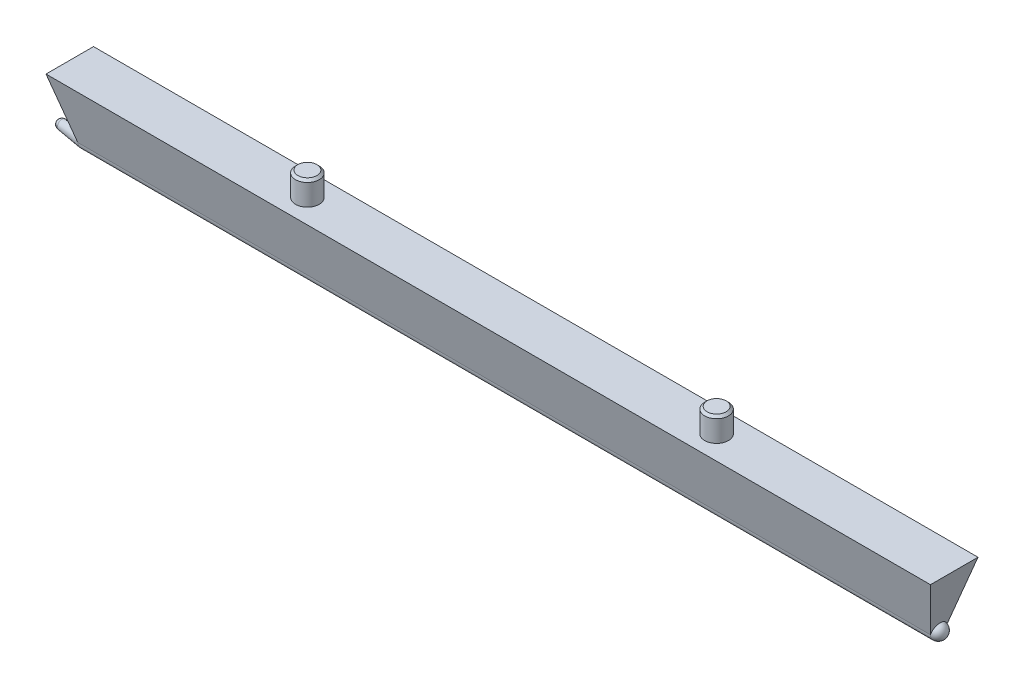
ISO-10303-21;
HEADER;
FILE_DESCRIPTION(('STEP AP214'),'2;1');
FILE_NAME('part.step','',(''),(''),'','','');
FILE_SCHEMA(('AUTOMOTIVE_DESIGN { 1 0 10303 214 1 1 1 1 }'));
ENDSEC;
DATA;
#1=APPLICATION_CONTEXT('core data for automotive mechanical design processes');
#2=APPLICATION_PROTOCOL_DEFINITION('international standard','automotive_design',2000,#1);
#3=PRODUCT_CONTEXT('',#1,'mechanical');
#4=PRODUCT('Part','Part','',(#3));
#5=PRODUCT_RELATED_PRODUCT_CATEGORY('part','',(#4));
#6=PRODUCT_DEFINITION_FORMATION('','',#4);
#7=PRODUCT_DEFINITION_CONTEXT('part definition',#1,'design');
#8=PRODUCT_DEFINITION('design','',#6,#7);
#9=PRODUCT_DEFINITION_SHAPE('','',#8);
#10=(LENGTH_UNIT() NAMED_UNIT(*) SI_UNIT(.MILLI.,.METRE.));
#11=(NAMED_UNIT(*) PLANE_ANGLE_UNIT() SI_UNIT($,.RADIAN.));
#12=(NAMED_UNIT(*) SI_UNIT($,.STERADIAN.) SOLID_ANGLE_UNIT());
#13=UNCERTAINTY_MEASURE_WITH_UNIT(LENGTH_MEASURE(1.E-05),#10,'distance_accuracy_value','');
#14=(GEOMETRIC_REPRESENTATION_CONTEXT(3) GLOBAL_UNCERTAINTY_ASSIGNED_CONTEXT((#13)) GLOBAL_UNIT_ASSIGNED_CONTEXT((#10,
#11,#12)) REPRESENTATION_CONTEXT('',''));
#15=CARTESIAN_POINT('',(0.,0.,0.));
#16=DIRECTION('',(0.,0.,1.));
#17=DIRECTION('',(1.,0.,0.));
#18=AXIS2_PLACEMENT_3D('',#15,#16,#17);
#19=CARTESIAN_POINT('',(-6.60254037844386,-50.,0.));
#20=DIRECTION('',(0.,0.,1.));
#21=DIRECTION('',(0.,-1.,0.));
#22=AXIS2_PLACEMENT_3D('',#19,#20,#21);
#23=SPHERICAL_SURFACE('',#22,3.791723684396);
#24=CARTESIAN_POINT('',(-6.60254037844386,-50.,3.79172368439599));
#25=VERTEX_POINT('',#24);
#26=VERTEX_LOOP('',#25);
#27=FACE_BOUND('',#26,.T.);
#28=ADVANCED_FACE('F45',(#27),#23,.T.);
#29=CLOSED_SHELL('',(#28));
#30=MANIFOLD_SOLID_BREP('B2',#29);
#31=CARTESIAN_POINT('',(13.3974596215561,-50.,0.));
#32=DIRECTION('',(1.,0.,0.));
#33=DIRECTION('',(0.,0.,1.));
#34=AXIS2_PLACEMENT_3D('',#31,#32,#33);
#35=CONICAL_SURFACE('',#34,6.60254037844383,0.139626340159547);
#36=CARTESIAN_POINT('',(-6.60254037844386,-50.,0.));
#37=DIRECTION('',(-1.,0.,0.));
#38=DIRECTION('',(0.,0.,1.));
#39=AXIS2_PLACEMENT_3D('',#36,#37,#38);
#40=CIRCLE('',#39,3.791723684396);
#41=CARTESIAN_POINT('',(-6.60254037844386,-50.,3.79172368439599));
#42=VERTEX_POINT('',#41);
#43=EDGE_CURVE('E44',#42,#42,#40,.T.);
#44=ORIENTED_EDGE('',*,*,#43,.F.);
#45=EDGE_LOOP('',(#44));
#46=FACE_BOUND('',#45,.T.);
#47=CARTESIAN_POINT('',(13.3974596215561,-50.,0.));
#48=DIRECTION('',(-1.,0.,0.));
#49=DIRECTION('',(0.,0.,1.));
#50=AXIS2_PLACEMENT_3D('',#47,#48,#49);
#51=CIRCLE('',#50,6.60254037844383);
#52=CARTESIAN_POINT('',(13.3974596215561,-50.,6.60254037844383));
#53=VERTEX_POINT('',#52);
#54=EDGE_CURVE('E75',#53,#53,#51,.T.);
#55=ORIENTED_EDGE('',*,*,#54,.T.);
#56=EDGE_LOOP('',(#55));
#57=FACE_BOUND('',#56,.T.);
#58=ADVANCED_FACE('F69',(#46,#57),#35,.T.);
#59=CARTESIAN_POINT('',(-6.60254037844386,-50.,0.));
#60=DIRECTION('',(-1.,0.,0.));
#61=DIRECTION('',(0.,0.,1.));
#62=AXIS2_PLACEMENT_3D('',#59,#60,#61);
#63=PLANE('',#62);
#64=ORIENTED_EDGE('',*,*,#43,.T.);
#65=EDGE_LOOP('',(#64));
#66=FACE_BOUND('',#65,.T.);
#67=ADVANCED_FACE('F84',(#66),#63,.T.);
#68=CARTESIAN_POINT('',(13.3974596215561,-50.,0.));
#69=DIRECTION('',(-1.,0.,0.));
#70=DIRECTION('',(0.,0.,1.));
#71=AXIS2_PLACEMENT_3D('',#68,#69,#70);
#72=PLANE('',#71);
#73=ORIENTED_EDGE('',*,*,#54,.F.);
#74=EDGE_LOOP('',(#73));
#75=FACE_BOUND('',#74,.T.);
#76=ADVANCED_FACE('F82',(#75),#72,.F.);
#77=CLOSED_SHELL('',(#58,#67,#76));
#78=MANIFOLD_SOLID_BREP('B6',#77);
#79=CARTESIAN_POINT('',(0.,0.,-20.));
#80=DIRECTION('',(0.,-0.258819045102521,-0.965925826289068));
#81=DIRECTION('',(0.,0.965925826289068,-0.258819045102521));
#82=AXIS2_PLACEMENT_3D('',#79,#80,#81);
#83=PLANE('',#82);
#84=DIRECTION('',(1.,0.,0.));
#85=VECTOR('',#84,1.);
#86=CARTESIAN_POINT('',(0.,0.,-20.));
#87=LINE('',#86,#85);
#88=CARTESIAN_POINT('',(0.,0.,-20.));
#89=VERTEX_POINT('',#88);
#90=CARTESIAN_POINT('',(744.4,0.,-20.));
#91=VERTEX_POINT('',#90);
#92=EDGE_CURVE('E166',#89,#91,#87,.T.);
#93=ORIENTED_EDGE('',*,*,#92,.T.);
#94=DIRECTION('',(0.250562807085732,0.935113126531029,-0.250562807085732));
#95=VECTOR('',#94,1.);
#96=CARTESIAN_POINT('',(744.4,0.,-20.));
#97=LINE('',#96,#95);
#98=CARTESIAN_POINT('',(731.002540378444,-50.,-6.60254037844383));
#99=VERTEX_POINT('',#98);
#100=EDGE_CURVE('E163',#99,#91,#97,.T.);
#101=ORIENTED_EDGE('',*,*,#100,.F.);
#102=DIRECTION('',(-1.,0.,0.));
#103=VECTOR('',#102,1.);
#104=CARTESIAN_POINT('',(0.,-50.,-6.60254037844383));
#105=LINE('',#104,#103);
#106=CARTESIAN_POINT('',(13.3974596215562,-50.,-6.60254037844383));
#107=VERTEX_POINT('',#106);
#108=EDGE_CURVE('E149',#107,#99,#105,.F.);
#109=ORIENTED_EDGE('',*,*,#108,.F.);
#110=DIRECTION('',(-0.250562807085732,0.935113126531029,-0.250562807085732));
#111=VECTOR('',#110,1.);
#112=CARTESIAN_POINT('',(0.,0.,-20.));
#113=LINE('',#112,#111);
#114=EDGE_CURVE('E169',#107,#89,#113,.T.);
#115=ORIENTED_EDGE('',*,*,#114,.T.);
#116=EDGE_LOOP('',(#93,#101,#109,#115));
#117=FACE_BOUND('',#116,.T.);
#118=ADVANCED_FACE('F109',(#117),#83,.T.);
#119=CARTESIAN_POINT('',(744.4,0.,-20.));
#120=DIRECTION('',(0.965925826289068,-0.258819045102521,0.));
#121=DIRECTION('',(0.258819045102521,0.965925826289068,0.));
#122=AXIS2_PLACEMENT_3D('',#119,#120,#121);
#123=PLANE('',#122);
#124=DIRECTION('',(0.250562807085732,0.935113126531029,0.250562807085732));
#125=VECTOR('',#124,1.);
#126=CARTESIAN_POINT('',(744.4,0.,19.9999999999999));
#127=LINE('',#126,#125);
#128=CARTESIAN_POINT('',(731.002540378444,-50.,6.60254037844379));
#129=VERTEX_POINT('',#128);
#130=CARTESIAN_POINT('',(744.4,0.,19.9999999999999));
#131=VERTEX_POINT('',#130);
#132=EDGE_CURVE('E170',#129,#131,#127,.T.);
#133=ORIENTED_EDGE('',*,*,#132,.F.);
#134=CARTESIAN_POINT('',(731.002540378444,-50.,0.));
#135=DIRECTION('',(0.965925826289068,-0.258819045102521,0.));
#136=DIRECTION('',(0.258819045102521,0.965925826289068,0.));
#137=AXIS2_PLACEMENT_3D('',#134,#135,#136);
#138=CIRCLE('',#137,6.60254037844381);
#139=EDGE_CURVE('E173',#129,#99,#138,.F.);
#140=ORIENTED_EDGE('',*,*,#139,.T.);
#141=ORIENTED_EDGE('',*,*,#100,.T.);
#142=DIRECTION('',(0.,0.,1.));
#143=VECTOR('',#142,1.);
#144=CARTESIAN_POINT('',(744.4,0.,-20.));
#145=LINE('',#144,#143);
#146=EDGE_CURVE('E183',#91,#131,#145,.T.);
#147=ORIENTED_EDGE('',*,*,#146,.T.);
#148=EDGE_LOOP('',(#133,#140,#141,#147));
#149=FACE_BOUND('',#148,.T.);
#150=ADVANCED_FACE('F174',(#149),#123,.T.);
#151=CARTESIAN_POINT('',(744.4,0.,19.9999999999999));
#152=DIRECTION('',(0.,-0.258819045102521,0.965925826289068));
#153=DIRECTION('',(0.,-0.965925826289068,-0.258819045102521));
#154=AXIS2_PLACEMENT_3D('',#151,#152,#153);
#155=PLANE('',#154);
#156=DIRECTION('',(-1.,0.,0.));
#157=VECTOR('',#156,1.);
#158=CARTESIAN_POINT('',(744.4,0.,19.9999999999999));
#159=LINE('',#158,#157);
#160=CARTESIAN_POINT('',(0.,0.,20.));
#161=VERTEX_POINT('',#160);
#162=EDGE_CURVE('E185',#131,#161,#159,.T.);
#163=ORIENTED_EDGE('',*,*,#162,.T.);
#164=DIRECTION('',(-0.250562807085732,0.935113126531029,0.250562807085732));
#165=VECTOR('',#164,1.);
#166=CARTESIAN_POINT('',(0.,0.,20.));
#167=LINE('',#166,#165);
#168=CARTESIAN_POINT('',(13.3974596215562,-50.,6.60254037844383));
#169=VERTEX_POINT('',#168);
#170=EDGE_CURVE('E191',#169,#161,#167,.T.);
#171=ORIENTED_EDGE('',*,*,#170,.F.);
#172=DIRECTION('',(1.,0.,0.));
#173=VECTOR('',#172,1.);
#174=CARTESIAN_POINT('',(744.4,-50.,6.60254037844374));
#175=LINE('',#174,#173);
#176=EDGE_CURVE('E160',#129,#169,#175,.F.);
#177=ORIENTED_EDGE('',*,*,#176,.F.);
#178=ORIENTED_EDGE('',*,*,#132,.T.);
#179=EDGE_LOOP('',(#163,#171,#177,#178));
#180=FACE_BOUND('',#179,.T.);
#181=ADVANCED_FACE('F225',(#180),#155,.T.);
#182=CARTESIAN_POINT('',(0.,0.,20.));
#183=DIRECTION('',(-0.965925826289068,-0.258819045102521,0.));
#184=DIRECTION('',(0.258819045102521,-0.965925826289068,0.));
#185=AXIS2_PLACEMENT_3D('',#182,#183,#184);
#186=PLANE('',#185);
#187=DIRECTION('',(0.,0.,-1.));
#188=VECTOR('',#187,1.);
#189=CARTESIAN_POINT('',(0.,0.,20.));
#190=LINE('',#189,#188);
#191=EDGE_CURVE('E187',#161,#89,#190,.T.);
#192=ORIENTED_EDGE('',*,*,#191,.T.);
#193=ORIENTED_EDGE('',*,*,#114,.F.);
#194=DIRECTION('',(0.,0.,1.));
#195=VECTOR('',#194,1.);
#196=CARTESIAN_POINT('',(13.3974596215562,-50.,20.));
#197=LINE('',#196,#195);
#198=EDGE_CURVE('E125',#169,#107,#197,.F.);
#199=ORIENTED_EDGE('',*,*,#198,.F.);
#200=ORIENTED_EDGE('',*,*,#170,.T.);
#201=EDGE_LOOP('',(#192,#193,#199,#200));
#202=FACE_BOUND('',#201,.T.);
#203=ADVANCED_FACE('F231',(#202),#186,.T.);
#204=CARTESIAN_POINT('',(0.,0.,0.));
#205=DIRECTION('',(0.,-1.,0.));
#206=DIRECTION('',(0.,0.,-1.));
#207=AXIS2_PLACEMENT_3D('',#204,#205,#206);
#208=PLANE('',#207);
#209=CARTESIAN_POINT('',(544.4,0.,0.));
#210=DIRECTION('',(0.,-1.,0.));
#211=DIRECTION('',(0.,0.,-1.));
#212=AXIS2_PLACEMENT_3D('',#209,#210,#211);
#213=CIRCLE('',#212,9.99999999999998);
#214=CARTESIAN_POINT('',(544.4,0.,-9.99999999999991));
#215=VERTEX_POINT('',#214);
#216=EDGE_CURVE('E198',#215,#215,#213,.F.);
#217=ORIENTED_EDGE('',*,*,#216,.F.);
#218=EDGE_LOOP('',(#217));
#219=FACE_BOUND('',#218,.T.);
#220=CARTESIAN_POINT('',(200.,0.,0.));
#221=DIRECTION('',(0.,-1.,0.));
#222=DIRECTION('',(0.,0.,-1.));
#223=AXIS2_PLACEMENT_3D('',#220,#221,#222);
#224=CIRCLE('',#223,10.);
#225=CARTESIAN_POINT('',(200.,0.,-10.));
#226=VERTEX_POINT('',#225);
#227=EDGE_CURVE('E190',#226,#226,#224,.F.);
#228=ORIENTED_EDGE('',*,*,#227,.F.);
#229=EDGE_LOOP('',(#228));
#230=FACE_BOUND('',#229,.T.);
#231=ORIENTED_EDGE('',*,*,#92,.F.);
#232=ORIENTED_EDGE('',*,*,#191,.F.);
#233=ORIENTED_EDGE('',*,*,#162,.F.);
#234=ORIENTED_EDGE('',*,*,#146,.F.);
#235=EDGE_LOOP('',(#231,#232,#233,#234));
#236=FACE_BOUND('',#235,.T.);
#237=ADVANCED_FACE('F229',(#219,#230,#236),#208,.F.);
#238=CARTESIAN_POINT('',(13.3974596215561,-50.,0.));
#239=DIRECTION('',(1.,0.,0.));
#240=DIRECTION('',(0.,0.,-1.));
#241=AXIS2_PLACEMENT_3D('',#238,#239,#240);
#242=CYLINDRICAL_SURFACE('',#241,6.60254037844383);
#243=CARTESIAN_POINT('',(13.3974596215561,-50.,0.));
#244=DIRECTION('',(1.,0.,0.));
#245=DIRECTION('',(0.,0.,-1.));
#246=AXIS2_PLACEMENT_3D('',#243,#244,#245);
#247=CIRCLE('',#246,6.60254037844383);
#248=EDGE_CURVE('E157',#169,#107,#247,.T.);
#249=ORIENTED_EDGE('',*,*,#248,.T.);
#250=ORIENTED_EDGE('',*,*,#108,.T.);
#251=CARTESIAN_POINT('',(731.002540378444,-50.,0.));
#252=DIRECTION('',(1.,0.,0.));
#253=DIRECTION('',(0.,0.,-1.));
#254=AXIS2_PLACEMENT_3D('',#251,#252,#253);
#255=CIRCLE('',#254,6.60254037844383);
#256=EDGE_CURVE('E154',#129,#99,#255,.T.);
#257=ORIENTED_EDGE('',*,*,#256,.F.);
#258=ORIENTED_EDGE('',*,*,#176,.T.);
#259=EDGE_LOOP('',(#249,#250,#257,#258));
#260=FACE_BOUND('',#259,.T.);
#261=ADVANCED_FACE('F151',(#260),#242,.T.);
#262=CARTESIAN_POINT('',(13.3974596215561,-50.,0.));
#263=DIRECTION('',(1.,0.,0.));
#264=DIRECTION('',(0.,0.,-1.));
#265=AXIS2_PLACEMENT_3D('',#262,#263,#264);
#266=PLANE('',#265);
#267=ORIENTED_EDGE('',*,*,#198,.T.);
#268=ORIENTED_EDGE('',*,*,#248,.F.);
#269=EDGE_LOOP('',(#267,#268));
#270=FACE_BOUND('',#269,.T.);
#271=ADVANCED_FACE('F247',(#270),#266,.F.);
#272=CARTESIAN_POINT('',(731.002540378444,-50.,0.));
#273=DIRECTION('',(0.,0.,1.));
#274=DIRECTION('',(0.,1.,0.));
#275=AXIS2_PLACEMENT_3D('',#272,#273,#274);
#276=SPHERICAL_SURFACE('',#275,6.60254037844381);
#277=ORIENTED_EDGE('',*,*,#139,.F.);
#278=ORIENTED_EDGE('',*,*,#256,.T.);
#279=EDGE_LOOP('',(#277,#278));
#280=FACE_BOUND('',#279,.T.);
#281=ADVANCED_FACE('F178',(#280),#276,.T.);
#282=CARTESIAN_POINT('',(200.,20.,0.));
#283=DIRECTION('',(0.,-1.,0.));
#284=DIRECTION('',(0.,0.,-1.));
#285=AXIS2_PLACEMENT_3D('',#282,#283,#284);
#286=CYLINDRICAL_SURFACE('',#285,10.);
#287=CARTESIAN_POINT('',(200.,18.0000000000001,0.));
#288=DIRECTION('',(0.,1.,0.));
#289=DIRECTION('',(0.,0.,1.));
#290=AXIS2_PLACEMENT_3D('',#287,#288,#289);
#291=CIRCLE('',#290,10.);
#292=CARTESIAN_POINT('',(200.,18.0000000000001,10.));
#293=VERTEX_POINT('',#292);
#294=EDGE_CURVE('E67',#293,#293,#291,.F.);
#295=ORIENTED_EDGE('',*,*,#294,.T.);
#296=EDGE_LOOP('',(#295));
#297=FACE_BOUND('',#296,.T.);
#298=ORIENTED_EDGE('',*,*,#227,.T.);
#299=EDGE_LOOP('',(#298));
#300=FACE_BOUND('',#299,.T.);
#301=ADVANCED_FACE('F254',(#297,#300),#286,.T.);
#302=CARTESIAN_POINT('',(200.,20.,0.));
#303=DIRECTION('',(0.,1.,0.));
#304=DIRECTION('',(0.,0.,1.));
#305=AXIS2_PLACEMENT_3D('',#302,#303,#304);
#306=PLANE('',#305);
#307=CARTESIAN_POINT('',(200.,20.,0.));
#308=DIRECTION('',(0.,1.,0.));
#309=DIRECTION('',(0.,0.,1.));
#310=AXIS2_PLACEMENT_3D('',#307,#308,#309);
#311=CIRCLE('',#310,8.00000000000001);
#312=CARTESIAN_POINT('',(200.,20.,8.00000000000001));
#313=VERTEX_POINT('',#312);
#314=EDGE_CURVE('E119',#313,#313,#311,.T.);
#315=ORIENTED_EDGE('',*,*,#314,.T.);
#316=EDGE_LOOP('',(#315));
#317=FACE_BOUND('',#316,.T.);
#318=ADVANCED_FACE('F209',(#317),#306,.T.);
#319=CARTESIAN_POINT('',(544.4,20.,0.));
#320=DIRECTION('',(0.,-1.,0.));
#321=DIRECTION('',(0.,0.,-1.));
#322=AXIS2_PLACEMENT_3D('',#319,#320,#321);
#323=CYLINDRICAL_SURFACE('',#322,9.99999999999998);
#324=CARTESIAN_POINT('',(544.4,18.0000000000001,0.));
#325=DIRECTION('',(0.,1.,0.));
#326=DIRECTION('',(0.,0.,1.));
#327=AXIS2_PLACEMENT_3D('',#324,#325,#326);
#328=CIRCLE('',#327,9.99999999999998);
#329=CARTESIAN_POINT('',(544.4,18.0000000000001,10.));
#330=VERTEX_POINT('',#329);
#331=EDGE_CURVE('E204',#330,#330,#328,.F.);
#332=ORIENTED_EDGE('',*,*,#331,.T.);
#333=EDGE_LOOP('',(#332));
#334=FACE_BOUND('',#333,.T.);
#335=ORIENTED_EDGE('',*,*,#216,.T.);
#336=EDGE_LOOP('',(#335));
#337=FACE_BOUND('',#336,.T.);
#338=ADVANCED_FACE('F262',(#334,#337),#323,.T.);
#339=CARTESIAN_POINT('',(544.4,20.,0.));
#340=DIRECTION('',(0.,1.,0.));
#341=DIRECTION('',(0.,0.,1.));
#342=AXIS2_PLACEMENT_3D('',#339,#340,#341);
#343=PLANE('',#342);
#344=CARTESIAN_POINT('',(544.4,20.,0.));
#345=DIRECTION('',(0.,1.,0.));
#346=DIRECTION('',(0.,0.,1.));
#347=AXIS2_PLACEMENT_3D('',#344,#345,#346);
#348=CIRCLE('',#347,8.00000000000001);
#349=CARTESIAN_POINT('',(544.4,20.,8.00000000000007));
#350=VERTEX_POINT('',#349);
#351=EDGE_CURVE('E201',#350,#350,#348,.T.);
#352=ORIENTED_EDGE('',*,*,#351,.T.);
#353=EDGE_LOOP('',(#352));
#354=FACE_BOUND('',#353,.T.);
#355=ADVANCED_FACE('F217',(#354),#343,.T.);
#356=CARTESIAN_POINT('',(544.4,20.,0.));
#357=DIRECTION('',(0.,-1.,0.));
#358=DIRECTION('',(0.,0.,-1.));
#359=AXIS2_PLACEMENT_3D('',#356,#357,#358);
#360=CONICAL_SURFACE('',#359,8.00000000000001,0.785398163397467);
#361=ORIENTED_EDGE('',*,*,#331,.F.);
#362=EDGE_LOOP('',(#361));
#363=FACE_BOUND('',#362,.T.);
#364=ORIENTED_EDGE('',*,*,#351,.F.);
#365=EDGE_LOOP('',(#364));
#366=FACE_BOUND('',#365,.T.);
#367=ADVANCED_FACE('F212',(#363,#366),#360,.T.);
#368=CARTESIAN_POINT('',(200.,20.,0.));
#369=DIRECTION('',(0.,-1.,0.));
#370=DIRECTION('',(0.,0.,-1.));
#371=AXIS2_PLACEMENT_3D('',#368,#369,#370);
#372=CONICAL_SURFACE('',#371,8.00000000000001,0.785398163397467);
#373=ORIENTED_EDGE('',*,*,#294,.F.);
#374=EDGE_LOOP('',(#373));
#375=FACE_BOUND('',#374,.T.);
#376=ORIENTED_EDGE('',*,*,#314,.F.);
#377=EDGE_LOOP('',(#376));
#378=FACE_BOUND('',#377,.T.);
#379=ADVANCED_FACE('F112',(#375,#378),#372,.T.);
#380=CLOSED_SHELL('',(#118,#150,#181,#203,#237,#261,#271,#281,#301,#318,#338,#355,#367,#379));
#381=MANIFOLD_SOLID_BREP('B39',#380);
#382=ADVANCED_BREP_SHAPE_REPRESENTATION('',(#18,#30,#78,#381),#14);
#383=SHAPE_DEFINITION_REPRESENTATION(#9,#382);
ENDSEC;
END-ISO-10303-21;
